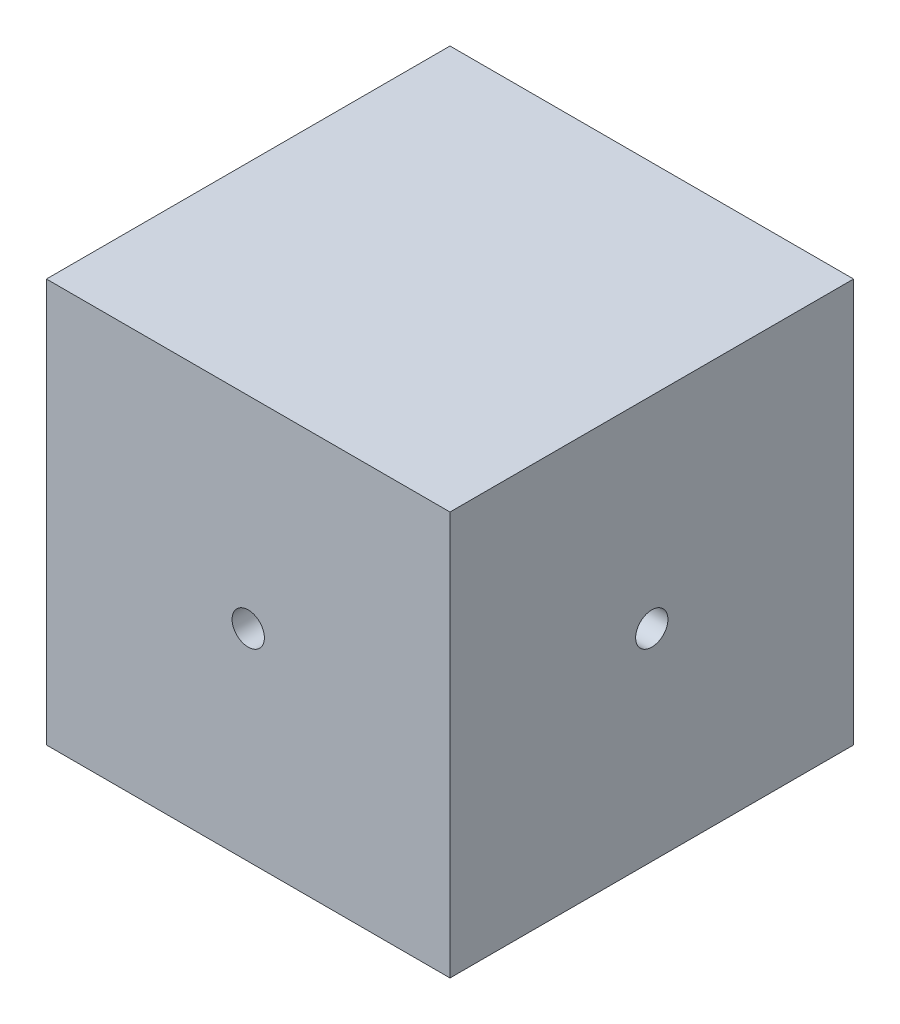
ISO-10303-21;
HEADER;
FILE_DESCRIPTION(('STEP AP214'),'2;1');
FILE_NAME('part.step','',(''),(''),'','','');
FILE_SCHEMA(('AUTOMOTIVE_DESIGN { 1 0 10303 214 1 1 1 1 }'));
ENDSEC;
DATA;
#1=APPLICATION_CONTEXT('core data for automotive mechanical design processes');
#2=APPLICATION_PROTOCOL_DEFINITION('international standard','automotive_design',2000,#1);
#3=PRODUCT_CONTEXT('',#1,'mechanical');
#4=PRODUCT('Part','Part','',(#3));
#5=PRODUCT_RELATED_PRODUCT_CATEGORY('part','',(#4));
#6=PRODUCT_DEFINITION_FORMATION('','',#4);
#7=PRODUCT_DEFINITION_CONTEXT('part definition',#1,'design');
#8=PRODUCT_DEFINITION('design','',#6,#7);
#9=PRODUCT_DEFINITION_SHAPE('','',#8);
#10=(LENGTH_UNIT() NAMED_UNIT(*) SI_UNIT(.MILLI.,.METRE.));
#11=(NAMED_UNIT(*) PLANE_ANGLE_UNIT() SI_UNIT($,.RADIAN.));
#12=(NAMED_UNIT(*) SI_UNIT($,.STERADIAN.) SOLID_ANGLE_UNIT());
#13=UNCERTAINTY_MEASURE_WITH_UNIT(LENGTH_MEASURE(1.E-05),#10,'distance_accuracy_value','');
#14=(GEOMETRIC_REPRESENTATION_CONTEXT(3) GLOBAL_UNCERTAINTY_ASSIGNED_CONTEXT((#13)) GLOBAL_UNIT_ASSIGNED_CONTEXT((#10,
#11,#12)) REPRESENTATION_CONTEXT('',''));
#15=CARTESIAN_POINT('',(0.,0.,0.));
#16=DIRECTION('',(0.,0.,1.));
#17=DIRECTION('',(1.,0.,0.));
#18=AXIS2_PLACEMENT_3D('',#15,#16,#17);
#19=CARTESIAN_POINT('',(0.,0.,0.));
#20=DIRECTION('',(0.,0.,1.));
#21=DIRECTION('',(1.,0.,0.));
#22=AXIS2_PLACEMENT_3D('',#19,#20,#21);
#23=CYLINDRICAL_SURFACE('',#22,2.);
#24=CARTESIAN_POINT('',(0.,0.,50.));
#25=DIRECTION('',(0.,0.,1.));
#26=DIRECTION('',(1.,0.,0.));
#27=AXIS2_PLACEMENT_3D('',#24,#25,#26);
#28=CIRCLE('',#27,2.);
#29=CARTESIAN_POINT('',(2.,0.,50.));
#30=VERTEX_POINT('',#29);
#31=EDGE_CURVE('E147',#30,#30,#28,.T.);
#32=ORIENTED_EDGE('',*,*,#31,.T.);
#33=EDGE_LOOP('',(#32));
#34=FACE_BOUND('',#33,.T.);
#35=CARTESIAN_POINT('',(0.,0.,25.));
#36=DIRECTION('',(-0.707106781186547,0.,0.707106781186547));
#37=DIRECTION('',(0.707106781186547,0.,0.707106781186547));
#38=AXIS2_PLACEMENT_3D('',#35,#36,#37);
#39=ELLIPSE('',#38,2.82842712474619,2.);
#40=CARTESIAN_POINT('',(0.,2.,25.));
#41=VERTEX_POINT('',#40);
#42=CARTESIAN_POINT('',(0.,-2.,25.));
#43=VERTEX_POINT('',#42);
#44=EDGE_CURVE('E53',#41,#43,#39,.F.);
#45=ORIENTED_EDGE('',*,*,#44,.T.);
#46=CARTESIAN_POINT('',(0.,0.,25.));
#47=DIRECTION('',(0.707106781186547,0.,0.707106781186547));
#48=DIRECTION('',(-0.707106781186547,0.,0.707106781186547));
#49=AXIS2_PLACEMENT_3D('',#46,#47,#48);
#50=ELLIPSE('',#49,2.82842712474619,2.);
#51=EDGE_CURVE('E11',#43,#41,#50,.F.);
#52=ORIENTED_EDGE('',*,*,#51,.T.);
#53=EDGE_LOOP('',(#45,#52));
#54=FACE_BOUND('',#53,.T.);
#55=ADVANCED_FACE('F39',(#34,#54),#23,.F.);
#56=CARTESIAN_POINT('',(25.,25.,50.));
#57=DIRECTION('',(-1.,0.,0.));
#58=DIRECTION('',(0.,-1.,0.));
#59=AXIS2_PLACEMENT_3D('',#56,#57,#58);
#60=PLANE('',#59);
#61=CARTESIAN_POINT('',(25.,0.,25.));
#62=DIRECTION('',(1.,0.,0.));
#63=DIRECTION('',(0.,1.,0.));
#64=AXIS2_PLACEMENT_3D('',#61,#62,#63);
#65=CIRCLE('',#64,2.);
#66=CARTESIAN_POINT('',(25.,2.,25.));
#67=VERTEX_POINT('',#66);
#68=EDGE_CURVE('E155',#67,#67,#65,.T.);
#69=ORIENTED_EDGE('',*,*,#68,.F.);
#70=EDGE_LOOP('',(#69));
#71=FACE_BOUND('',#70,.T.);
#72=DIRECTION('',(0.,1.,0.));
#73=VECTOR('',#72,1.);
#74=CARTESIAN_POINT('',(25.,25.,0.));
#75=LINE('',#74,#73);
#76=CARTESIAN_POINT('',(25.,-25.,0.));
#77=VERTEX_POINT('',#76);
#78=CARTESIAN_POINT('',(25.,25.,0.));
#79=VERTEX_POINT('',#78);
#80=EDGE_CURVE('E133',#77,#79,#75,.T.);
#81=ORIENTED_EDGE('',*,*,#80,.T.);
#82=DIRECTION('',(0.,0.,-1.));
#83=VECTOR('',#82,1.);
#84=CARTESIAN_POINT('',(25.,25.,50.));
#85=LINE('',#84,#83);
#86=CARTESIAN_POINT('',(25.,25.,50.));
#87=VERTEX_POINT('',#86);
#88=EDGE_CURVE('E106',#87,#79,#85,.T.);
#89=ORIENTED_EDGE('',*,*,#88,.F.);
#90=DIRECTION('',(0.,1.,0.));
#91=VECTOR('',#90,1.);
#92=CARTESIAN_POINT('',(25.,25.,50.));
#93=LINE('',#92,#91);
#94=CARTESIAN_POINT('',(25.,-25.,50.));
#95=VERTEX_POINT('',#94);
#96=EDGE_CURVE('E126',#95,#87,#93,.T.);
#97=ORIENTED_EDGE('',*,*,#96,.F.);
#98=DIRECTION('',(0.,0.,-1.));
#99=VECTOR('',#98,1.);
#100=CARTESIAN_POINT('',(25.,-25.,50.));
#101=LINE('',#100,#99);
#102=EDGE_CURVE('E121',#95,#77,#101,.T.);
#103=ORIENTED_EDGE('',*,*,#102,.T.);
#104=EDGE_LOOP('',(#81,#89,#97,#103));
#105=FACE_BOUND('',#104,.T.);
#106=ADVANCED_FACE('F41',(#71,#105),#60,.F.);
#107=CARTESIAN_POINT('',(-25.,25.,50.));
#108=DIRECTION('',(0.,-1.,0.));
#109=DIRECTION('',(0.,0.,-1.));
#110=AXIS2_PLACEMENT_3D('',#107,#108,#109);
#111=PLANE('',#110);
#112=DIRECTION('',(-1.,0.,0.));
#113=VECTOR('',#112,1.);
#114=CARTESIAN_POINT('',(-25.,25.,0.));
#115=LINE('',#114,#113);
#116=CARTESIAN_POINT('',(-25.,25.,0.));
#117=VERTEX_POINT('',#116);
#118=EDGE_CURVE('E130',#79,#117,#115,.T.);
#119=ORIENTED_EDGE('',*,*,#118,.T.);
#120=DIRECTION('',(0.,0.,-1.));
#121=VECTOR('',#120,1.);
#122=CARTESIAN_POINT('',(-25.,25.,50.));
#123=LINE('',#122,#121);
#124=CARTESIAN_POINT('',(-25.,25.,50.));
#125=VERTEX_POINT('',#124);
#126=EDGE_CURVE('E114',#125,#117,#123,.T.);
#127=ORIENTED_EDGE('',*,*,#126,.F.);
#128=DIRECTION('',(-1.,0.,0.));
#129=VECTOR('',#128,1.);
#130=CARTESIAN_POINT('',(-25.,25.,50.));
#131=LINE('',#130,#129);
#132=EDGE_CURVE('E91',#87,#125,#131,.T.);
#133=ORIENTED_EDGE('',*,*,#132,.F.);
#134=ORIENTED_EDGE('',*,*,#88,.T.);
#135=EDGE_LOOP('',(#119,#127,#133,#134));
#136=FACE_BOUND('',#135,.T.);
#137=ADVANCED_FACE('F178',(#136),#111,.F.);
#138=CARTESIAN_POINT('',(-25.,25.,50.));
#139=DIRECTION('',(1.,0.,0.));
#140=DIRECTION('',(0.,1.,0.));
#141=AXIS2_PLACEMENT_3D('',#138,#139,#140);
#142=PLANE('',#141);
#143=CARTESIAN_POINT('',(-25.,0.,25.));
#144=DIRECTION('',(1.,0.,0.));
#145=DIRECTION('',(0.,1.,0.));
#146=AXIS2_PLACEMENT_3D('',#143,#144,#145);
#147=CIRCLE('',#146,2.);
#148=CARTESIAN_POINT('',(-25.,2.,25.));
#149=VERTEX_POINT('',#148);
#150=EDGE_CURVE('E151',#149,#149,#147,.T.);
#151=ORIENTED_EDGE('',*,*,#150,.T.);
#152=EDGE_LOOP('',(#151));
#153=FACE_BOUND('',#152,.T.);
#154=DIRECTION('',(0.,-1.,0.));
#155=VECTOR('',#154,1.);
#156=CARTESIAN_POINT('',(-25.,25.,0.));
#157=LINE('',#156,#155);
#158=CARTESIAN_POINT('',(-25.,-25.,0.));
#159=VERTEX_POINT('',#158);
#160=EDGE_CURVE('E127',#117,#159,#157,.T.);
#161=ORIENTED_EDGE('',*,*,#160,.T.);
#162=DIRECTION('',(0.,0.,-1.));
#163=VECTOR('',#162,1.);
#164=CARTESIAN_POINT('',(-25.,-25.,50.));
#165=LINE('',#164,#163);
#166=CARTESIAN_POINT('',(-25.,-25.,50.));
#167=VERTEX_POINT('',#166);
#168=EDGE_CURVE('E118',#167,#159,#165,.T.);
#169=ORIENTED_EDGE('',*,*,#168,.F.);
#170=DIRECTION('',(0.,-1.,0.));
#171=VECTOR('',#170,1.);
#172=CARTESIAN_POINT('',(-25.,25.,50.));
#173=LINE('',#172,#171);
#174=EDGE_CURVE('E140',#125,#167,#173,.T.);
#175=ORIENTED_EDGE('',*,*,#174,.F.);
#176=ORIENTED_EDGE('',*,*,#126,.T.);
#177=EDGE_LOOP('',(#161,#169,#175,#176));
#178=FACE_BOUND('',#177,.T.);
#179=ADVANCED_FACE('F163',(#153,#178),#142,.F.);
#180=CARTESIAN_POINT('',(-25.,-25.,50.));
#181=DIRECTION('',(0.,1.,0.));
#182=DIRECTION('',(0.,0.,1.));
#183=AXIS2_PLACEMENT_3D('',#180,#181,#182);
#184=PLANE('',#183);
#185=DIRECTION('',(1.,0.,0.));
#186=VECTOR('',#185,1.);
#187=CARTESIAN_POINT('',(-25.,-25.,0.));
#188=LINE('',#187,#186);
#189=EDGE_CURVE('E83',#159,#77,#188,.T.);
#190=ORIENTED_EDGE('',*,*,#189,.T.);
#191=ORIENTED_EDGE('',*,*,#102,.F.);
#192=DIRECTION('',(1.,0.,0.));
#193=VECTOR('',#192,1.);
#194=CARTESIAN_POINT('',(-25.,-25.,50.));
#195=LINE('',#194,#193);
#196=EDGE_CURVE('E62',#167,#95,#195,.T.);
#197=ORIENTED_EDGE('',*,*,#196,.F.);
#198=ORIENTED_EDGE('',*,*,#168,.T.);
#199=EDGE_LOOP('',(#190,#191,#197,#198));
#200=FACE_BOUND('',#199,.T.);
#201=ADVANCED_FACE('F192',(#200),#184,.F.);
#202=CARTESIAN_POINT('',(0.,0.,50.));
#203=DIRECTION('',(0.,0.,1.));
#204=DIRECTION('',(1.,0.,0.));
#205=AXIS2_PLACEMENT_3D('',#202,#203,#204);
#206=PLANE('',#205);
#207=ORIENTED_EDGE('',*,*,#31,.F.);
#208=EDGE_LOOP('',(#207));
#209=FACE_BOUND('',#208,.T.);
#210=ORIENTED_EDGE('',*,*,#96,.T.);
#211=ORIENTED_EDGE('',*,*,#132,.T.);
#212=ORIENTED_EDGE('',*,*,#174,.T.);
#213=ORIENTED_EDGE('',*,*,#196,.T.);
#214=EDGE_LOOP('',(#210,#211,#212,#213));
#215=FACE_BOUND('',#214,.T.);
#216=ADVANCED_FACE('F186',(#209,#215),#206,.T.);
#217=CARTESIAN_POINT('',(0.,0.,0.));
#218=DIRECTION('',(0.,0.,1.));
#219=DIRECTION('',(1.,0.,0.));
#220=AXIS2_PLACEMENT_3D('',#217,#218,#219);
#221=PLANE('',#220);
#222=CARTESIAN_POINT('',(0.,0.,0.));
#223=DIRECTION('',(0.,0.,1.));
#224=DIRECTION('',(1.,0.,0.));
#225=AXIS2_PLACEMENT_3D('',#222,#223,#224);
#226=CIRCLE('',#225,2.);
#227=CARTESIAN_POINT('',(2.,0.,0.));
#228=VERTEX_POINT('',#227);
#229=EDGE_CURVE('E137',#228,#228,#226,.T.);
#230=ORIENTED_EDGE('',*,*,#229,.T.);
#231=EDGE_LOOP('',(#230));
#232=FACE_BOUND('',#231,.T.);
#233=ORIENTED_EDGE('',*,*,#80,.F.);
#234=ORIENTED_EDGE('',*,*,#189,.F.);
#235=ORIENTED_EDGE('',*,*,#160,.F.);
#236=ORIENTED_EDGE('',*,*,#118,.F.);
#237=EDGE_LOOP('',(#233,#234,#235,#236));
#238=FACE_BOUND('',#237,.T.);
#239=ADVANCED_FACE('F182',(#232,#238),#221,.F.);
#240=CARTESIAN_POINT('',(0.,0.,25.));
#241=DIRECTION('',(-0.707106781186547,0.,0.707106781186547));
#242=DIRECTION('',(0.707106781186547,0.,0.707106781186547));
#243=AXIS2_PLACEMENT_3D('',#240,#241,#242);
#244=ELLIPSE('',#243,2.82842712474619,2.);
#245=EDGE_CURVE('E97',#41,#43,#244,.T.);
#246=ORIENTED_EDGE('',*,*,#245,.T.);
#247=CARTESIAN_POINT('',(0.,0.,25.));
#248=DIRECTION('',(0.707106781186547,0.,0.707106781186547));
#249=DIRECTION('',(-0.707106781186547,0.,0.707106781186547));
#250=AXIS2_PLACEMENT_3D('',#247,#248,#249);
#251=ELLIPSE('',#250,2.82842712474619,2.);
#252=EDGE_CURVE('E48',#43,#41,#251,.T.);
#253=ORIENTED_EDGE('',*,*,#252,.T.);
#254=EDGE_LOOP('',(#246,#253));
#255=FACE_BOUND('',#254,.T.);
#256=ORIENTED_EDGE('',*,*,#229,.F.);
#257=EDGE_LOOP('',(#256));
#258=FACE_BOUND('',#257,.T.);
#259=ADVANCED_FACE('F108',(#255,#258),#23,.F.);
#260=CARTESIAN_POINT('',(-25.,0.,25.));
#261=DIRECTION('',(1.,0.,0.));
#262=DIRECTION('',(0.,1.,0.));
#263=AXIS2_PLACEMENT_3D('',#260,#261,#262);
#264=CYLINDRICAL_SURFACE('',#263,2.);
#265=ORIENTED_EDGE('',*,*,#68,.T.);
#266=EDGE_LOOP('',(#265));
#267=FACE_BOUND('',#266,.T.);
#268=ORIENTED_EDGE('',*,*,#44,.F.);
#269=ORIENTED_EDGE('',*,*,#252,.F.);
#270=EDGE_LOOP('',(#268,#269));
#271=FACE_BOUND('',#270,.T.);
#272=ADVANCED_FACE('F104',(#267,#271),#264,.F.);
#273=ORIENTED_EDGE('',*,*,#150,.F.);
#274=EDGE_LOOP('',(#273));
#275=FACE_BOUND('',#274,.T.);
#276=ORIENTED_EDGE('',*,*,#245,.F.);
#277=ORIENTED_EDGE('',*,*,#51,.F.);
#278=EDGE_LOOP('',(#276,#277));
#279=FACE_BOUND('',#278,.T.);
#280=ADVANCED_FACE('F98',(#275,#279),#264,.F.);
#281=CLOSED_SHELL('',(#55,#106,#137,#179,#201,#216,#239,#259,#272,#280));
#282=MANIFOLD_SOLID_BREP('B2',#281);
#283=ADVANCED_BREP_SHAPE_REPRESENTATION('',(#18,#282),#14);
#284=SHAPE_DEFINITION_REPRESENTATION(#9,#283);
ENDSEC;
END-ISO-10303-21;
